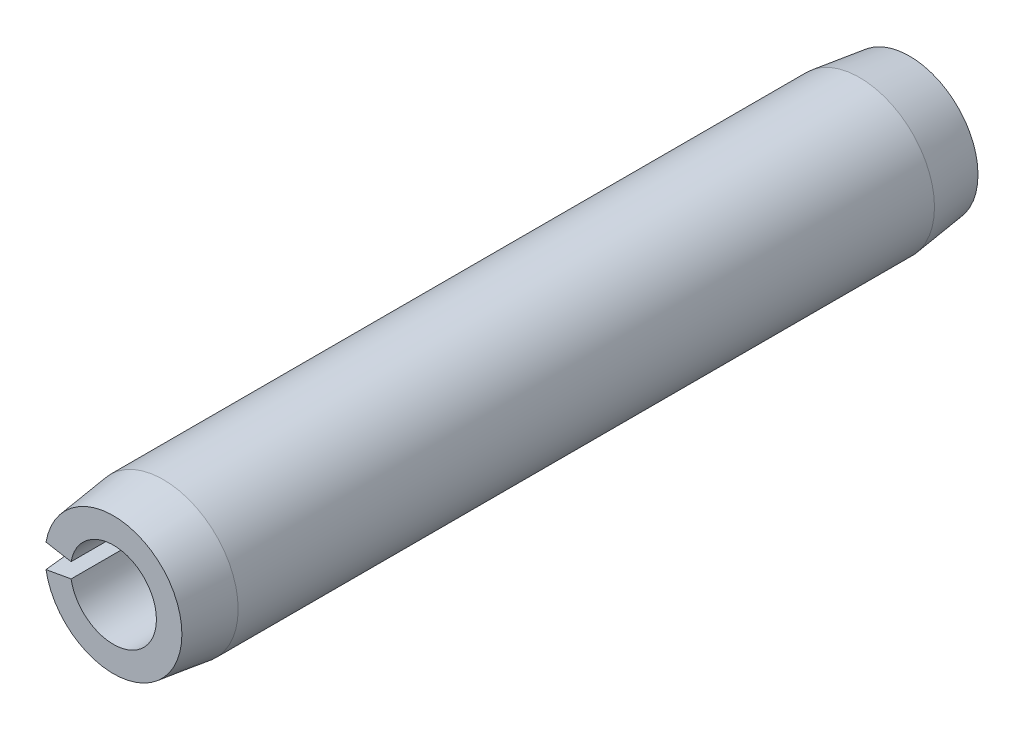
ISO-10303-21;
HEADER;
FILE_DESCRIPTION(('STEP AP214'),'2;1');
FILE_NAME('part.step','',(''),(''),'','','');
FILE_SCHEMA(('AUTOMOTIVE_DESIGN { 1 0 10303 214 1 1 1 1 }'));
ENDSEC;
DATA;
#1=APPLICATION_CONTEXT('core data for automotive mechanical design processes');
#2=APPLICATION_PROTOCOL_DEFINITION('international standard','automotive_design',2000,#1);
#3=PRODUCT_CONTEXT('',#1,'mechanical');
#4=PRODUCT('Part','Part','',(#3));
#5=PRODUCT_RELATED_PRODUCT_CATEGORY('part','',(#4));
#6=PRODUCT_DEFINITION_FORMATION('','',#4);
#7=PRODUCT_DEFINITION_CONTEXT('part definition',#1,'design');
#8=PRODUCT_DEFINITION('design','',#6,#7);
#9=PRODUCT_DEFINITION_SHAPE('','',#8);
#10=(LENGTH_UNIT() NAMED_UNIT(*) SI_UNIT(.MILLI.,.METRE.));
#11=(NAMED_UNIT(*) PLANE_ANGLE_UNIT() SI_UNIT($,.RADIAN.));
#12=(NAMED_UNIT(*) SI_UNIT($,.STERADIAN.) SOLID_ANGLE_UNIT());
#13=UNCERTAINTY_MEASURE_WITH_UNIT(LENGTH_MEASURE(1.E-05),#10,'distance_accuracy_value','');
#14=(GEOMETRIC_REPRESENTATION_CONTEXT(3) GLOBAL_UNCERTAINTY_ASSIGNED_CONTEXT((#13)) GLOBAL_UNIT_ASSIGNED_CONTEXT((#10,
#11,#12)) REPRESENTATION_CONTEXT('',''));
#15=CARTESIAN_POINT('',(0.,0.,0.));
#16=DIRECTION('',(0.,0.,1.));
#17=DIRECTION('',(1.,0.,0.));
#18=AXIS2_PLACEMENT_3D('',#15,#16,#17);
#19=CARTESIAN_POINT('',(0.,0.,12.7));
#20=DIRECTION('',(0.,0.,1.));
#21=DIRECTION('',(1.,0.,0.));
#22=AXIS2_PLACEMENT_3D('',#19,#20,#21);
#23=PLANE('',#22);
#24=CARTESIAN_POINT('',(0.,0.,12.7));
#25=DIRECTION('',(0.,0.,-1.));
#26=DIRECTION('',(-1.,0.,0.));
#27=AXIS2_PLACEMENT_3D('',#24,#25,#26);
#28=CIRCLE('',#27,2.18440000000001);
#29=CARTESIAN_POINT('',(-2.15121405567987,0.379317079295636,12.7));
#30=VERTEX_POINT('',#29);
#31=CARTESIAN_POINT('',(-2.15121405567987,-0.379317079295636,12.7));
#32=VERTEX_POINT('',#31);
#33=EDGE_CURVE('E119',#30,#32,#28,.T.);
#34=ORIENTED_EDGE('',*,*,#33,.F.);
#35=DIRECTION('',(0.984807753012209,-0.173648177666927,0.));
#36=VECTOR('',#35,1.);
#37=CARTESIAN_POINT('',(-2.35132699109195,0.414602388997554,12.7));
#38=LINE('',#37,#36);
#39=CARTESIAN_POINT('',(-1.35076231403155,0.238175840487957,12.7));
#40=VERTEX_POINT('',#39);
#41=EDGE_CURVE('E140',#30,#40,#38,.T.);
#42=ORIENTED_EDGE('',*,*,#41,.T.);
#43=CARTESIAN_POINT('',(0.,0.,12.7));
#44=DIRECTION('',(0.,0.,-1.));
#45=DIRECTION('',(1.,0.,0.));
#46=AXIS2_PLACEMENT_3D('',#43,#44,#45);
#47=CIRCLE('',#46,1.3716);
#48=CARTESIAN_POINT('',(-1.35076231403155,-0.238175840487957,12.7));
#49=VERTEX_POINT('',#48);
#50=EDGE_CURVE('E139',#40,#49,#47,.T.);
#51=ORIENTED_EDGE('',*,*,#50,.T.);
#52=DIRECTION('',(-0.984807753012209,-0.173648177666927,0.));
#53=VECTOR('',#52,1.);
#54=CARTESIAN_POINT('',(-1.35076231403155,-0.238175840487957,12.7));
#55=LINE('',#54,#53);
#56=EDGE_CURVE('E133',#49,#32,#55,.T.);
#57=ORIENTED_EDGE('',*,*,#56,.T.);
#58=EDGE_LOOP('',(#34,#42,#51,#57));
#59=FACE_BOUND('',#58,.T.);
#60=ADVANCED_FACE('F67',(#59),#23,.T.);
#61=CARTESIAN_POINT('',(0.,0.,-12.7));
#62=DIRECTION('',(0.,0.,1.));
#63=DIRECTION('',(1.,0.,0.));
#64=AXIS2_PLACEMENT_3D('',#61,#62,#63);
#65=CYLINDRICAL_SURFACE('',#64,1.3716);
#66=DIRECTION('',(0.,0.,1.));
#67=VECTOR('',#66,1.);
#68=CARTESIAN_POINT('',(-1.35076231403155,-0.238175840487957,-12.7));
#69=LINE('',#68,#67);
#70=CARTESIAN_POINT('',(-1.35076231403155,-0.238175840487957,-12.7));
#71=VERTEX_POINT('',#70);
#72=EDGE_CURVE('E71',#71,#49,#69,.T.);
#73=ORIENTED_EDGE('',*,*,#72,.T.);
#74=ORIENTED_EDGE('',*,*,#50,.F.);
#75=DIRECTION('',(0.,0.,1.));
#76=VECTOR('',#75,1.);
#77=CARTESIAN_POINT('',(-1.35076231403155,0.238175840487957,-12.7));
#78=LINE('',#77,#76);
#79=CARTESIAN_POINT('',(-1.35076231403155,0.238175840487957,-12.7));
#80=VERTEX_POINT('',#79);
#81=EDGE_CURVE('E12',#80,#40,#78,.T.);
#82=ORIENTED_EDGE('',*,*,#81,.F.);
#83=CARTESIAN_POINT('',(0.,0.,-12.7));
#84=DIRECTION('',(0.,0.,-1.));
#85=DIRECTION('',(1.,0.,0.));
#86=AXIS2_PLACEMENT_3D('',#83,#84,#85);
#87=CIRCLE('',#86,1.3716);
#88=EDGE_CURVE('E142',#80,#71,#87,.T.);
#89=ORIENTED_EDGE('',*,*,#88,.T.);
#90=EDGE_LOOP('',(#73,#74,#82,#89));
#91=FACE_BOUND('',#90,.T.);
#92=ADVANCED_FACE('F69',(#91),#65,.F.);
#93=CARTESIAN_POINT('',(-2.35132699109195,0.414602388997554,-12.7));
#94=DIRECTION('',(-0.173648177666927,-0.984807753012209,0.));
#95=DIRECTION('',(0.984807753012209,-0.173648177666927,0.));
#96=AXIS2_PLACEMENT_3D('',#93,#94,#95);
#97=PLANE('',#96);
#98=DIRECTION('',(-0.124708063857782,0.0219893963700406,-0.991949779603849));
#99=VECTOR('',#98,1.);
#100=CARTESIAN_POINT('',(0.,0.,29.8111333333334));
#101=LINE('',#100,#99);
#102=CARTESIAN_POINT('',(-2.35132699109195,0.414602388997555,11.1082666666667));
#103=VERTEX_POINT('',#102);
#104=EDGE_CURVE('E84',#103,#30,#101,.F.);
#105=ORIENTED_EDGE('',*,*,#104,.F.);
#106=DIRECTION('',(0.,0.,1.));
#107=VECTOR('',#106,1.);
#108=CARTESIAN_POINT('',(-2.35132699109195,0.414602388997554,-12.7));
#109=LINE('',#108,#107);
#110=CARTESIAN_POINT('',(-2.35132699109195,0.414602388997555,-11.1082666666667));
#111=VERTEX_POINT('',#110);
#112=EDGE_CURVE('E76',#111,#103,#109,.T.);
#113=ORIENTED_EDGE('',*,*,#112,.F.);
#114=DIRECTION('',(0.124708063857782,-0.0219893963700406,-0.991949779603849));
#115=VECTOR('',#114,1.);
#116=CARTESIAN_POINT('',(0.,0.,-29.8111333333334));
#117=LINE('',#116,#115);
#118=CARTESIAN_POINT('',(-2.15121405567987,0.379317079295636,-12.7));
#119=VERTEX_POINT('',#118);
#120=EDGE_CURVE('E144',#119,#111,#117,.F.);
#121=ORIENTED_EDGE('',*,*,#120,.F.);
#122=DIRECTION('',(0.984807753012209,-0.173648177666927,0.));
#123=VECTOR('',#122,1.);
#124=CARTESIAN_POINT('',(-2.35132699109195,0.414602388997554,-12.7));
#125=LINE('',#124,#123);
#126=EDGE_CURVE('E153',#119,#80,#125,.T.);
#127=ORIENTED_EDGE('',*,*,#126,.T.);
#128=ORIENTED_EDGE('',*,*,#81,.T.);
#129=ORIENTED_EDGE('',*,*,#41,.F.);
#130=EDGE_LOOP('',(#105,#113,#121,#127,#128,#129));
#131=FACE_BOUND('',#130,.T.);
#132=ADVANCED_FACE('F176',(#131),#97,.T.);
#133=CARTESIAN_POINT('',(0.,0.,-12.7));
#134=DIRECTION('',(0.,0.,1.));
#135=DIRECTION('',(1.,0.,0.));
#136=AXIS2_PLACEMENT_3D('',#133,#134,#135);
#137=CYLINDRICAL_SURFACE('',#136,2.3876);
#138=CARTESIAN_POINT('',(0.,0.,11.1082666666667));
#139=DIRECTION('',(0.,0.,-1.));
#140=DIRECTION('',(-1.,0.,0.));
#141=AXIS2_PLACEMENT_3D('',#138,#139,#140);
#142=CIRCLE('',#141,2.38760000000001);
#143=CARTESIAN_POINT('',(-2.35132699109196,-0.414602388997556,11.1082666666667));
#144=VERTEX_POINT('',#143);
#145=EDGE_CURVE('E127',#103,#144,#142,.T.);
#146=ORIENTED_EDGE('',*,*,#145,.T.);
#147=DIRECTION('',(0.,0.,1.));
#148=VECTOR('',#147,1.);
#149=CARTESIAN_POINT('',(-2.35132699109195,-0.414602388997555,-12.7));
#150=LINE('',#149,#148);
#151=CARTESIAN_POINT('',(-2.35132699109196,-0.414602388997556,-11.1082666666667));
#152=VERTEX_POINT('',#151);
#153=EDGE_CURVE('E136',#152,#144,#150,.T.);
#154=ORIENTED_EDGE('',*,*,#153,.F.);
#155=CARTESIAN_POINT('',(0.,0.,-11.1082666666667));
#156=DIRECTION('',(0.,0.,-1.));
#157=DIRECTION('',(-1.,0.,0.));
#158=AXIS2_PLACEMENT_3D('',#155,#156,#157);
#159=CIRCLE('',#158,2.38760000000001);
#160=EDGE_CURVE('E165',#111,#152,#159,.T.);
#161=ORIENTED_EDGE('',*,*,#160,.F.);
#162=ORIENTED_EDGE('',*,*,#112,.T.);
#163=EDGE_LOOP('',(#146,#154,#161,#162));
#164=FACE_BOUND('',#163,.T.);
#165=ADVANCED_FACE('F175',(#164),#137,.T.);
#166=CARTESIAN_POINT('',(-1.35076231403155,-0.238175840487957,-12.7));
#167=DIRECTION('',(-0.173648177666927,0.984807753012209,0.));
#168=DIRECTION('',(-0.984807753012209,-0.173648177666927,0.));
#169=AXIS2_PLACEMENT_3D('',#166,#167,#168);
#170=PLANE('',#169);
#171=DIRECTION('',(0.124708063857782,0.0219893963700406,0.991949779603849));
#172=VECTOR('',#171,1.);
#173=CARTESIAN_POINT('',(0.,0.,29.8111333333334));
#174=LINE('',#173,#172);
#175=EDGE_CURVE('E122',#32,#144,#174,.F.);
#176=ORIENTED_EDGE('',*,*,#175,.F.);
#177=ORIENTED_EDGE('',*,*,#56,.F.);
#178=ORIENTED_EDGE('',*,*,#72,.F.);
#179=DIRECTION('',(-0.984807753012209,-0.173648177666927,0.));
#180=VECTOR('',#179,1.);
#181=CARTESIAN_POINT('',(-1.35076231403155,-0.238175840487957,-12.7));
#182=LINE('',#181,#180);
#183=CARTESIAN_POINT('',(-2.15121405567988,-0.379317079295636,-12.7));
#184=VERTEX_POINT('',#183);
#185=EDGE_CURVE('E150',#71,#184,#182,.T.);
#186=ORIENTED_EDGE('',*,*,#185,.T.);
#187=DIRECTION('',(-0.124708063857782,-0.0219893963700406,0.991949779603849));
#188=VECTOR('',#187,1.);
#189=CARTESIAN_POINT('',(0.,0.,-29.8111333333334));
#190=LINE('',#189,#188);
#191=EDGE_CURVE('E92',#152,#184,#190,.F.);
#192=ORIENTED_EDGE('',*,*,#191,.F.);
#193=ORIENTED_EDGE('',*,*,#153,.T.);
#194=EDGE_LOOP('',(#176,#177,#178,#186,#192,#193));
#195=FACE_BOUND('',#194,.T.);
#196=ADVANCED_FACE('F132',(#195),#170,.T.);
#197=CARTESIAN_POINT('',(0.,0.,-12.7));
#198=DIRECTION('',(0.,0.,1.));
#199=DIRECTION('',(1.,0.,0.));
#200=AXIS2_PLACEMENT_3D('',#197,#198,#199);
#201=PLANE('',#200);
#202=ORIENTED_EDGE('',*,*,#126,.F.);
#203=CARTESIAN_POINT('',(0.,0.,-12.7));
#204=DIRECTION('',(0.,0.,-1.));
#205=DIRECTION('',(-1.,0.,0.));
#206=AXIS2_PLACEMENT_3D('',#203,#204,#205);
#207=CIRCLE('',#206,2.18440000000001);
#208=EDGE_CURVE('E163',#119,#184,#207,.T.);
#209=ORIENTED_EDGE('',*,*,#208,.T.);
#210=ORIENTED_EDGE('',*,*,#185,.F.);
#211=ORIENTED_EDGE('',*,*,#88,.F.);
#212=EDGE_LOOP('',(#202,#209,#210,#211));
#213=FACE_BOUND('',#212,.T.);
#214=ADVANCED_FACE('F162',(#213),#201,.F.);
#215=CARTESIAN_POINT('',(0.,0.,-11.1082666666667));
#216=DIRECTION('',(0.,0.,1.));
#217=DIRECTION('',(1.,0.,0.));
#218=AXIS2_PLACEMENT_3D('',#215,#216,#217);
#219=CONICAL_SURFACE('',#218,2.38760000000001,0.126972789614079);
#220=ORIENTED_EDGE('',*,*,#120,.T.);
#221=ORIENTED_EDGE('',*,*,#160,.T.);
#222=ORIENTED_EDGE('',*,*,#191,.T.);
#223=ORIENTED_EDGE('',*,*,#208,.F.);
#224=EDGE_LOOP('',(#220,#221,#222,#223));
#225=FACE_BOUND('',#224,.T.);
#226=ADVANCED_FACE('F171',(#225),#219,.T.);
#227=CARTESIAN_POINT('',(0.,0.,11.1082666666667));
#228=DIRECTION('',(0.,0.,-1.));
#229=DIRECTION('',(1.,0.,0.));
#230=AXIS2_PLACEMENT_3D('',#227,#228,#229);
#231=CONICAL_SURFACE('',#230,2.38760000000001,0.126972789614079);
#232=ORIENTED_EDGE('',*,*,#104,.T.);
#233=ORIENTED_EDGE('',*,*,#33,.T.);
#234=ORIENTED_EDGE('',*,*,#175,.T.);
#235=ORIENTED_EDGE('',*,*,#145,.F.);
#236=EDGE_LOOP('',(#232,#233,#234,#235));
#237=FACE_BOUND('',#236,.T.);
#238=ADVANCED_FACE('F121',(#237),#231,.T.);
#239=CLOSED_SHELL('',(#60,#92,#132,#165,#196,#214,#226,#238));
#240=MANIFOLD_SOLID_BREP('B2',#239);
#241=ADVANCED_BREP_SHAPE_REPRESENTATION('',(#18,#240),#14);
#242=SHAPE_DEFINITION_REPRESENTATION(#9,#241);
ENDSEC;
END-ISO-10303-21;
